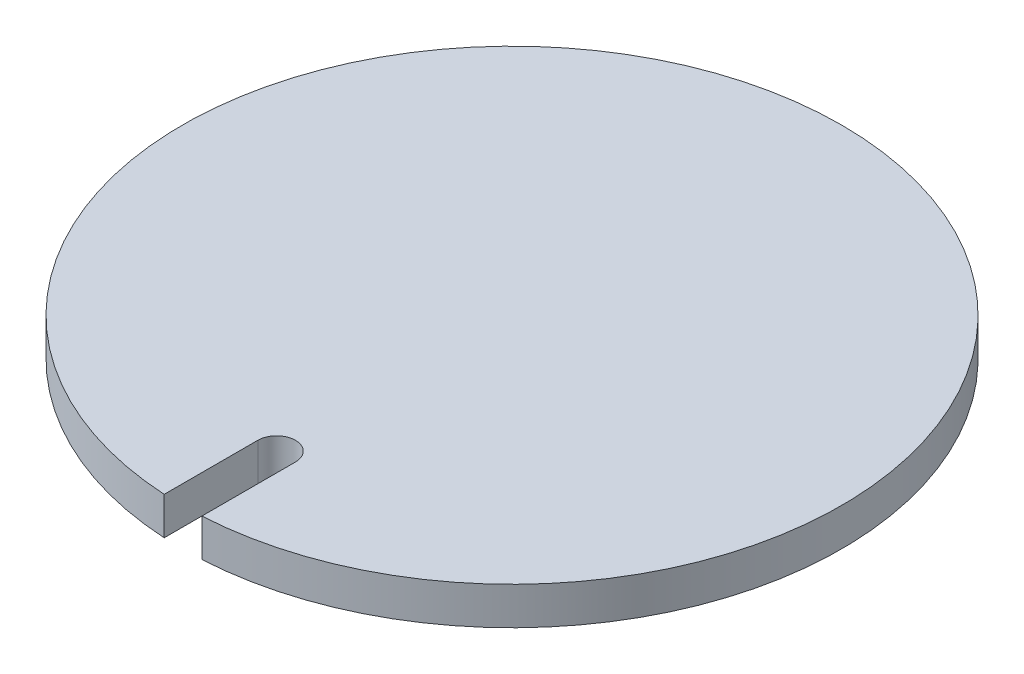
ISO-10303-21;
HEADER;
FILE_DESCRIPTION(('STEP AP214'),'2;1');
FILE_NAME('part.step','',(''),(''),'','','');
FILE_SCHEMA(('AUTOMOTIVE_DESIGN { 1 0 10303 214 1 1 1 1 }'));
ENDSEC;
DATA;
#1=APPLICATION_CONTEXT('core data for automotive mechanical design processes');
#2=APPLICATION_PROTOCOL_DEFINITION('international standard','automotive_design',2000,#1);
#3=PRODUCT_CONTEXT('',#1,'mechanical');
#4=PRODUCT('Part','Part','',(#3));
#5=PRODUCT_RELATED_PRODUCT_CATEGORY('part','',(#4));
#6=PRODUCT_DEFINITION_FORMATION('','',#4);
#7=PRODUCT_DEFINITION_CONTEXT('part definition',#1,'design');
#8=PRODUCT_DEFINITION('design','',#6,#7);
#9=PRODUCT_DEFINITION_SHAPE('','',#8);
#10=(LENGTH_UNIT() NAMED_UNIT(*) SI_UNIT(.MILLI.,.METRE.));
#11=(NAMED_UNIT(*) PLANE_ANGLE_UNIT() SI_UNIT($,.RADIAN.));
#12=(NAMED_UNIT(*) SI_UNIT($,.STERADIAN.) SOLID_ANGLE_UNIT());
#13=UNCERTAINTY_MEASURE_WITH_UNIT(LENGTH_MEASURE(1.E-05),#10,'distance_accuracy_value','');
#14=(GEOMETRIC_REPRESENTATION_CONTEXT(3) GLOBAL_UNCERTAINTY_ASSIGNED_CONTEXT((#13)) GLOBAL_UNIT_ASSIGNED_CONTEXT((#10,
#11,#12)) REPRESENTATION_CONTEXT('',''));
#15=CARTESIAN_POINT('',(0.,0.,0.));
#16=DIRECTION('',(0.,0.,1.));
#17=DIRECTION('',(1.,0.,0.));
#18=AXIS2_PLACEMENT_3D('',#15,#16,#17);
#19=CARTESIAN_POINT('',(0.,1.,6.25));
#20=DIRECTION('',(0.,-1.,0.));
#21=DIRECTION('',(0.,0.,-1.));
#22=AXIS2_PLACEMENT_3D('',#19,#20,#21);
#23=CYLINDRICAL_SURFACE('',#22,0.5);
#24=CARTESIAN_POINT('',(0.,0.,6.25));
#25=DIRECTION('',(0.,1.,0.));
#26=DIRECTION('',(0.,0.,1.));
#27=AXIS2_PLACEMENT_3D('',#24,#25,#26);
#28=CIRCLE('',#27,0.5);
#29=CARTESIAN_POINT('',(0.5,0.,6.25));
#30=VERTEX_POINT('',#29);
#31=CARTESIAN_POINT('',(-0.5,0.,6.25));
#32=VERTEX_POINT('',#31);
#33=EDGE_CURVE('E98',#30,#32,#28,.T.);
#34=ORIENTED_EDGE('',*,*,#33,.F.);
#35=DIRECTION('',(0.,-1.,0.));
#36=VECTOR('',#35,1.);
#37=CARTESIAN_POINT('',(0.5,1.,6.25));
#38=LINE('',#37,#36);
#39=CARTESIAN_POINT('',(0.5,1.,6.25));
#40=VERTEX_POINT('',#39);
#41=EDGE_CURVE('E11',#40,#30,#38,.T.);
#42=ORIENTED_EDGE('',*,*,#41,.F.);
#43=CARTESIAN_POINT('',(0.,1.,6.25));
#44=DIRECTION('',(0.,1.,0.));
#45=DIRECTION('',(0.,0.,1.));
#46=AXIS2_PLACEMENT_3D('',#43,#44,#45);
#47=CIRCLE('',#46,0.5);
#48=CARTESIAN_POINT('',(-0.5,1.,6.25));
#49=VERTEX_POINT('',#48);
#50=EDGE_CURVE('E92',#40,#49,#47,.T.);
#51=ORIENTED_EDGE('',*,*,#50,.T.);
#52=DIRECTION('',(0.,-1.,0.));
#53=VECTOR('',#52,1.);
#54=CARTESIAN_POINT('',(-0.5,1.,6.25));
#55=LINE('',#54,#53);
#56=EDGE_CURVE('E73',#49,#32,#55,.T.);
#57=ORIENTED_EDGE('',*,*,#56,.T.);
#58=EDGE_LOOP('',(#34,#42,#51,#57));
#59=FACE_BOUND('',#58,.T.);
#60=ADVANCED_FACE('F35',(#59),#23,.F.);
#61=CARTESIAN_POINT('',(0.5,1.,0.));
#62=DIRECTION('',(-1.,0.,0.));
#63=DIRECTION('',(0.,0.,1.));
#64=AXIS2_PLACEMENT_3D('',#61,#62,#63);
#65=PLANE('',#64);
#66=DIRECTION('',(0.,0.,-1.));
#67=VECTOR('',#66,1.);
#68=CARTESIAN_POINT('',(0.5,0.,0.));
#69=LINE('',#68,#67);
#70=CARTESIAN_POINT('',(0.5,0.,8.73570260482808));
#71=VERTEX_POINT('',#70);
#72=EDGE_CURVE('E86',#71,#30,#69,.T.);
#73=ORIENTED_EDGE('',*,*,#72,.F.);
#74=DIRECTION('',(0.,-1.,0.));
#75=VECTOR('',#74,1.);
#76=CARTESIAN_POINT('',(0.5,1.,8.73570260482808));
#77=LINE('',#76,#75);
#78=CARTESIAN_POINT('',(0.5,1.,8.73570260482808));
#79=VERTEX_POINT('',#78);
#80=EDGE_CURVE('E43',#79,#71,#77,.T.);
#81=ORIENTED_EDGE('',*,*,#80,.F.);
#82=DIRECTION('',(0.,0.,-1.));
#83=VECTOR('',#82,1.);
#84=CARTESIAN_POINT('',(0.5,1.,0.));
#85=LINE('',#84,#83);
#86=EDGE_CURVE('E84',#79,#40,#85,.T.);
#87=ORIENTED_EDGE('',*,*,#86,.T.);
#88=ORIENTED_EDGE('',*,*,#41,.T.);
#89=EDGE_LOOP('',(#73,#81,#87,#88));
#90=FACE_BOUND('',#89,.T.);
#91=ADVANCED_FACE('F82',(#90),#65,.T.);
#92=CARTESIAN_POINT('',(0.,1.,0.));
#93=DIRECTION('',(0.,-1.,0.));
#94=DIRECTION('',(0.,0.,-1.));
#95=AXIS2_PLACEMENT_3D('',#92,#93,#94);
#96=CYLINDRICAL_SURFACE('',#95,8.75);
#97=CARTESIAN_POINT('',(0.,0.,0.));
#98=DIRECTION('',(0.,1.,0.));
#99=DIRECTION('',(0.,0.,1.));
#100=AXIS2_PLACEMENT_3D('',#97,#98,#99);
#101=CIRCLE('',#100,8.75);
#102=CARTESIAN_POINT('',(-0.5,0.,8.73570260482808));
#103=VERTEX_POINT('',#102);
#104=EDGE_CURVE('E66',#71,#103,#101,.T.);
#105=ORIENTED_EDGE('',*,*,#104,.T.);
#106=DIRECTION('',(0.,-1.,0.));
#107=VECTOR('',#106,1.);
#108=CARTESIAN_POINT('',(-0.5,1.,8.73570260482808));
#109=LINE('',#108,#107);
#110=CARTESIAN_POINT('',(-0.5,1.,8.73570260482808));
#111=VERTEX_POINT('',#110);
#112=EDGE_CURVE('E87',#111,#103,#109,.T.);
#113=ORIENTED_EDGE('',*,*,#112,.F.);
#114=CARTESIAN_POINT('',(0.,1.,0.));
#115=DIRECTION('',(0.,1.,0.));
#116=DIRECTION('',(0.,0.,1.));
#117=AXIS2_PLACEMENT_3D('',#114,#115,#116);
#118=CIRCLE('',#117,8.75);
#119=EDGE_CURVE('E88',#79,#111,#118,.T.);
#120=ORIENTED_EDGE('',*,*,#119,.F.);
#121=ORIENTED_EDGE('',*,*,#80,.T.);
#122=EDGE_LOOP('',(#105,#113,#120,#121));
#123=FACE_BOUND('',#122,.T.);
#124=ADVANCED_FACE('F89',(#123),#96,.T.);
#125=CARTESIAN_POINT('',(-0.5,1.,0.));
#126=DIRECTION('',(-1.,0.,0.));
#127=DIRECTION('',(0.,0.,1.));
#128=AXIS2_PLACEMENT_3D('',#125,#126,#127);
#129=PLANE('',#128);
#130=DIRECTION('',(0.,0.,-1.));
#131=VECTOR('',#130,1.);
#132=CARTESIAN_POINT('',(-0.5,0.,0.));
#133=LINE('',#132,#131);
#134=EDGE_CURVE('E94',#103,#32,#133,.T.);
#135=ORIENTED_EDGE('',*,*,#134,.T.);
#136=ORIENTED_EDGE('',*,*,#56,.F.);
#137=DIRECTION('',(0.,0.,-1.));
#138=VECTOR('',#137,1.);
#139=CARTESIAN_POINT('',(-0.5,1.,0.));
#140=LINE('',#139,#138);
#141=EDGE_CURVE('E51',#111,#49,#140,.T.);
#142=ORIENTED_EDGE('',*,*,#141,.F.);
#143=ORIENTED_EDGE('',*,*,#112,.T.);
#144=EDGE_LOOP('',(#135,#136,#142,#143));
#145=FACE_BOUND('',#144,.T.);
#146=ADVANCED_FACE('F107',(#145),#129,.F.);
#147=CARTESIAN_POINT('',(0.,1.,0.));
#148=DIRECTION('',(0.,1.,0.));
#149=DIRECTION('',(0.,0.,1.));
#150=AXIS2_PLACEMENT_3D('',#147,#148,#149);
#151=PLANE('',#150);
#152=ORIENTED_EDGE('',*,*,#50,.F.);
#153=ORIENTED_EDGE('',*,*,#86,.F.);
#154=ORIENTED_EDGE('',*,*,#119,.T.);
#155=ORIENTED_EDGE('',*,*,#141,.T.);
#156=EDGE_LOOP('',(#152,#153,#154,#155));
#157=FACE_BOUND('',#156,.T.);
#158=ADVANCED_FACE('F91',(#157),#151,.T.);
#159=CARTESIAN_POINT('',(0.,0.,0.));
#160=DIRECTION('',(0.,1.,0.));
#161=DIRECTION('',(0.,0.,1.));
#162=AXIS2_PLACEMENT_3D('',#159,#160,#161);
#163=PLANE('',#162);
#164=ORIENTED_EDGE('',*,*,#33,.T.);
#165=ORIENTED_EDGE('',*,*,#134,.F.);
#166=ORIENTED_EDGE('',*,*,#104,.F.);
#167=ORIENTED_EDGE('',*,*,#72,.T.);
#168=EDGE_LOOP('',(#164,#165,#166,#167));
#169=FACE_BOUND('',#168,.T.);
#170=ADVANCED_FACE('F109',(#169),#163,.F.);
#171=CLOSED_SHELL('',(#60,#91,#124,#146,#158,#170));
#172=MANIFOLD_SOLID_BREP('B2',#171);
#173=ADVANCED_BREP_SHAPE_REPRESENTATION('',(#18,#172),#14);
#174=SHAPE_DEFINITION_REPRESENTATION(#9,#173);
ENDSEC;
END-ISO-10303-21;
